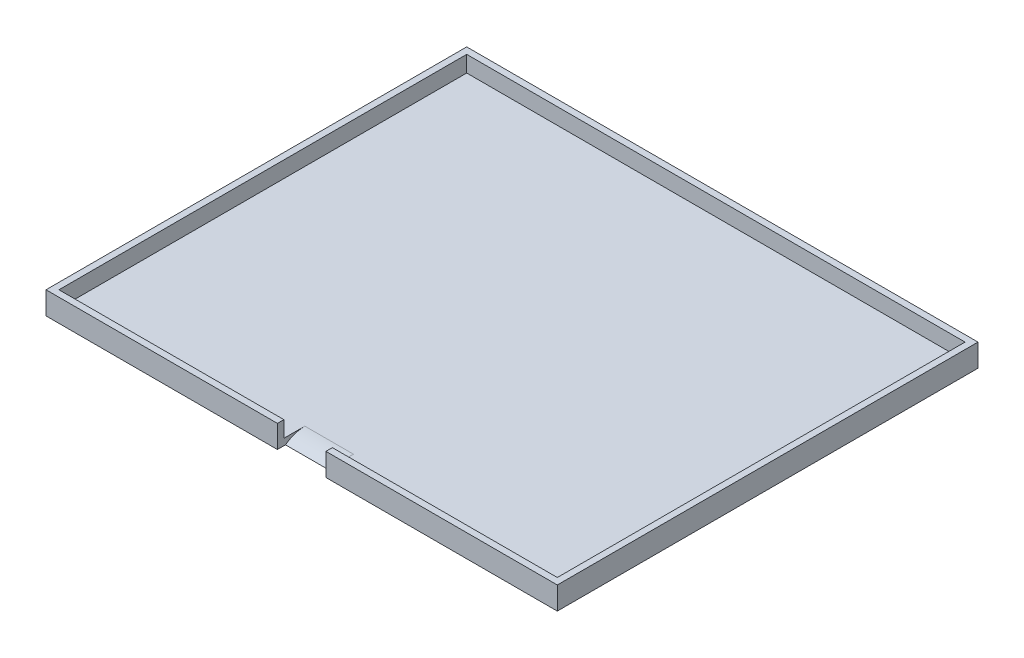
ISO-10303-21;
HEADER;
FILE_DESCRIPTION(('STEP AP214'),'2;1');
FILE_NAME('part.step','',(''),(''),'','','');
FILE_SCHEMA(('AUTOMOTIVE_DESIGN { 1 0 10303 214 1 1 1 1 }'));
ENDSEC;
DATA;
#1=APPLICATION_CONTEXT('core data for automotive mechanical design processes');
#2=APPLICATION_PROTOCOL_DEFINITION('international standard','automotive_design',2000,#1);
#3=PRODUCT_CONTEXT('',#1,'mechanical');
#4=PRODUCT('Part','Part','',(#3));
#5=PRODUCT_RELATED_PRODUCT_CATEGORY('part','',(#4));
#6=PRODUCT_DEFINITION_FORMATION('','',#4);
#7=PRODUCT_DEFINITION_CONTEXT('part definition',#1,'design');
#8=PRODUCT_DEFINITION('design','',#6,#7);
#9=PRODUCT_DEFINITION_SHAPE('','',#8);
#10=(LENGTH_UNIT() NAMED_UNIT(*) SI_UNIT(.MILLI.,.METRE.));
#11=(NAMED_UNIT(*) PLANE_ANGLE_UNIT() SI_UNIT($,.RADIAN.));
#12=(NAMED_UNIT(*) SI_UNIT($,.STERADIAN.) SOLID_ANGLE_UNIT());
#13=UNCERTAINTY_MEASURE_WITH_UNIT(LENGTH_MEASURE(1.E-05),#10,'distance_accuracy_value','');
#14=(GEOMETRIC_REPRESENTATION_CONTEXT(3) GLOBAL_UNCERTAINTY_ASSIGNED_CONTEXT((#13)) GLOBAL_UNIT_ASSIGNED_CONTEXT((#10,
#11,#12)) REPRESENTATION_CONTEXT('',''));
#15=CARTESIAN_POINT('',(0.,0.,0.));
#16=DIRECTION('',(0.,0.,1.));
#17=DIRECTION('',(1.,0.,0.));
#18=AXIS2_PLACEMENT_3D('',#15,#16,#17);
#19=CARTESIAN_POINT('',(-39.5,3.5,32.5));
#20=DIRECTION('',(0.,0.,-1.));
#21=DIRECTION('',(-1.,0.,0.));
#22=AXIS2_PLACEMENT_3D('',#19,#20,#21);
#23=PLANE('',#22);
#24=DIRECTION('',(1.,0.,0.));
#25=VECTOR('',#24,1.);
#26=CARTESIAN_POINT('',(-39.5,3.5,32.5));
#27=LINE('',#26,#25);
#28=CARTESIAN_POINT('',(3.75,3.5,32.5));
#29=VERTEX_POINT('',#28);
#30=CARTESIAN_POINT('',(39.5,3.5,32.5));
#31=VERTEX_POINT('',#30);
#32=EDGE_CURVE('E218',#29,#31,#27,.T.);
#33=ORIENTED_EDGE('',*,*,#32,.F.);
#34=DIRECTION('',(0.,1.,0.));
#35=VECTOR('',#34,1.);
#36=CARTESIAN_POINT('',(3.75,5.5,32.5));
#37=LINE('',#36,#35);
#38=CARTESIAN_POINT('',(3.75,0.,32.5));
#39=VERTEX_POINT('',#38);
#40=EDGE_CURVE('E165',#39,#29,#37,.T.);
#41=ORIENTED_EDGE('',*,*,#40,.F.);
#42=DIRECTION('',(1.,0.,0.));
#43=VECTOR('',#42,1.);
#44=CARTESIAN_POINT('',(-39.5,0.,32.5));
#45=LINE('',#44,#43);
#46=CARTESIAN_POINT('',(39.5,0.,32.5));
#47=VERTEX_POINT('',#46);
#48=EDGE_CURVE('E155',#39,#47,#45,.T.);
#49=ORIENTED_EDGE('',*,*,#48,.T.);
#50=DIRECTION('',(0.,-1.,0.));
#51=VECTOR('',#50,1.);
#52=CARTESIAN_POINT('',(39.5,3.5,32.5));
#53=LINE('',#52,#51);
#54=EDGE_CURVE('E222',#31,#47,#53,.T.);
#55=ORIENTED_EDGE('',*,*,#54,.F.);
#56=EDGE_LOOP('',(#33,#41,#49,#55));
#57=FACE_BOUND('',#56,.T.);
#58=ADVANCED_FACE('F41',(#57),#23,.F.);
#59=CARTESIAN_POINT('',(38.5,1.,31.5));
#60=DIRECTION('',(0.,0.,1.));
#61=DIRECTION('',(1.,0.,0.));
#62=AXIS2_PLACEMENT_3D('',#59,#60,#61);
#63=PLANE('',#62);
#64=DIRECTION('',(1.,0.,0.));
#65=VECTOR('',#64,1.);
#66=CARTESIAN_POINT('',(38.5,1.,31.5));
#67=LINE('',#66,#65);
#68=CARTESIAN_POINT('',(3.75,1.,31.5));
#69=VERTEX_POINT('',#68);
#70=CARTESIAN_POINT('',(38.5,1.,31.5));
#71=VERTEX_POINT('',#70);
#72=EDGE_CURVE('E179',#69,#71,#67,.T.);
#73=ORIENTED_EDGE('',*,*,#72,.F.);
#74=DIRECTION('',(0.,1.,0.));
#75=VECTOR('',#74,1.);
#76=CARTESIAN_POINT('',(3.75,1.,31.5));
#77=LINE('',#76,#75);
#78=CARTESIAN_POINT('',(3.75,3.5,31.5));
#79=VERTEX_POINT('',#78);
#80=EDGE_CURVE('E172',#69,#79,#77,.T.);
#81=ORIENTED_EDGE('',*,*,#80,.T.);
#82=DIRECTION('',(1.,0.,0.));
#83=VECTOR('',#82,1.);
#84=CARTESIAN_POINT('',(38.5,3.5,31.5));
#85=LINE('',#84,#83);
#86=CARTESIAN_POINT('',(38.5,3.5,31.5));
#87=VERTEX_POINT('',#86);
#88=EDGE_CURVE('E191',#79,#87,#85,.T.);
#89=ORIENTED_EDGE('',*,*,#88,.T.);
#90=DIRECTION('',(0.,1.,0.));
#91=VECTOR('',#90,1.);
#92=CARTESIAN_POINT('',(38.5,1.,31.5));
#93=LINE('',#92,#91);
#94=EDGE_CURVE('E205',#71,#87,#93,.T.);
#95=ORIENTED_EDGE('',*,*,#94,.F.);
#96=EDGE_LOOP('',(#73,#81,#89,#95));
#97=FACE_BOUND('',#96,.T.);
#98=ADVANCED_FACE('F248',(#97),#63,.F.);
#99=CARTESIAN_POINT('',(39.5,3.5,-32.5));
#100=DIRECTION('',(-1.,0.,0.));
#101=DIRECTION('',(0.,0.,1.));
#102=AXIS2_PLACEMENT_3D('',#99,#100,#101);
#103=PLANE('',#102);
#104=DIRECTION('',(0.,0.,-1.));
#105=VECTOR('',#104,1.);
#106=CARTESIAN_POINT('',(39.5,0.,-32.5));
#107=LINE('',#106,#105);
#108=CARTESIAN_POINT('',(39.5,0.,-32.5));
#109=VERTEX_POINT('',#108);
#110=EDGE_CURVE('E202',#47,#109,#107,.T.);
#111=ORIENTED_EDGE('',*,*,#110,.T.);
#112=DIRECTION('',(0.,-1.,0.));
#113=VECTOR('',#112,1.);
#114=CARTESIAN_POINT('',(39.5,3.5,-32.5));
#115=LINE('',#114,#113);
#116=CARTESIAN_POINT('',(39.5,3.5,-32.5));
#117=VERTEX_POINT('',#116);
#118=EDGE_CURVE('E239',#117,#109,#115,.T.);
#119=ORIENTED_EDGE('',*,*,#118,.F.);
#120=DIRECTION('',(0.,0.,-1.));
#121=VECTOR('',#120,1.);
#122=CARTESIAN_POINT('',(39.5,3.5,-32.5));
#123=LINE('',#122,#121);
#124=EDGE_CURVE('E210',#31,#117,#123,.T.);
#125=ORIENTED_EDGE('',*,*,#124,.F.);
#126=ORIENTED_EDGE('',*,*,#54,.T.);
#127=EDGE_LOOP('',(#111,#119,#125,#126));
#128=FACE_BOUND('',#127,.T.);
#129=ADVANCED_FACE('F288',(#128),#103,.F.);
#130=CARTESIAN_POINT('',(-39.5,3.5,-32.5));
#131=DIRECTION('',(0.,0.,1.));
#132=DIRECTION('',(1.,0.,0.));
#133=AXIS2_PLACEMENT_3D('',#130,#131,#132);
#134=PLANE('',#133);
#135=DIRECTION('',(-1.,0.,0.));
#136=VECTOR('',#135,1.);
#137=CARTESIAN_POINT('',(-39.5,0.,-32.5));
#138=LINE('',#137,#136);
#139=CARTESIAN_POINT('',(-39.5,0.,-32.5));
#140=VERTEX_POINT('',#139);
#141=EDGE_CURVE('E225',#109,#140,#138,.T.);
#142=ORIENTED_EDGE('',*,*,#141,.T.);
#143=DIRECTION('',(0.,-1.,0.));
#144=VECTOR('',#143,1.);
#145=CARTESIAN_POINT('',(-39.5,3.5,-32.5));
#146=LINE('',#145,#144);
#147=CARTESIAN_POINT('',(-39.5,3.5,-32.5));
#148=VERTEX_POINT('',#147);
#149=EDGE_CURVE('E236',#148,#140,#146,.T.);
#150=ORIENTED_EDGE('',*,*,#149,.F.);
#151=DIRECTION('',(-1.,0.,0.));
#152=VECTOR('',#151,1.);
#153=CARTESIAN_POINT('',(-39.5,3.5,-32.5));
#154=LINE('',#153,#152);
#155=EDGE_CURVE('E213',#117,#148,#154,.T.);
#156=ORIENTED_EDGE('',*,*,#155,.F.);
#157=ORIENTED_EDGE('',*,*,#118,.T.);
#158=EDGE_LOOP('',(#142,#150,#156,#157));
#159=FACE_BOUND('',#158,.T.);
#160=ADVANCED_FACE('F284',(#159),#134,.F.);
#161=CARTESIAN_POINT('',(-39.5,3.5,-32.5));
#162=DIRECTION('',(1.,0.,0.));
#163=DIRECTION('',(0.,0.,-1.));
#164=AXIS2_PLACEMENT_3D('',#161,#162,#163);
#165=PLANE('',#164);
#166=DIRECTION('',(0.,0.,1.));
#167=VECTOR('',#166,1.);
#168=CARTESIAN_POINT('',(-39.5,0.,-32.5));
#169=LINE('',#168,#167);
#170=CARTESIAN_POINT('',(-39.5,0.,32.5));
#171=VERTEX_POINT('',#170);
#172=EDGE_CURVE('E227',#140,#171,#169,.T.);
#173=ORIENTED_EDGE('',*,*,#172,.T.);
#174=DIRECTION('',(0.,-1.,0.));
#175=VECTOR('',#174,1.);
#176=CARTESIAN_POINT('',(-39.5,3.5,32.5));
#177=LINE('',#176,#175);
#178=CARTESIAN_POINT('',(-39.5,3.5,32.5));
#179=VERTEX_POINT('',#178);
#180=EDGE_CURVE('E233',#179,#171,#177,.T.);
#181=ORIENTED_EDGE('',*,*,#180,.F.);
#182=DIRECTION('',(0.,0.,1.));
#183=VECTOR('',#182,1.);
#184=CARTESIAN_POINT('',(-39.5,3.5,-32.5));
#185=LINE('',#184,#183);
#186=EDGE_CURVE('E216',#148,#179,#185,.T.);
#187=ORIENTED_EDGE('',*,*,#186,.F.);
#188=ORIENTED_EDGE('',*,*,#149,.T.);
#189=EDGE_LOOP('',(#173,#181,#187,#188));
#190=FACE_BOUND('',#189,.T.);
#191=ADVANCED_FACE('F281',(#190),#165,.F.);
#192=CARTESIAN_POINT('',(-3.75,0.,32.5));
#193=VERTEX_POINT('',#192);
#194=EDGE_CURVE('E214',#171,#193,#45,.T.);
#195=ORIENTED_EDGE('',*,*,#194,.T.);
#196=DIRECTION('',(0.,-1.,0.));
#197=VECTOR('',#196,1.);
#198=CARTESIAN_POINT('',(-3.75,5.5,32.5));
#199=LINE('',#198,#197);
#200=CARTESIAN_POINT('',(-3.75,3.5,32.5));
#201=VERTEX_POINT('',#200);
#202=EDGE_CURVE('E160',#201,#193,#199,.T.);
#203=ORIENTED_EDGE('',*,*,#202,.F.);
#204=EDGE_CURVE('E219',#179,#201,#27,.T.);
#205=ORIENTED_EDGE('',*,*,#204,.F.);
#206=ORIENTED_EDGE('',*,*,#180,.T.);
#207=EDGE_LOOP('',(#195,#203,#205,#206));
#208=FACE_BOUND('',#207,.T.);
#209=ADVANCED_FACE('F277',(#208),#23,.F.);
#210=CARTESIAN_POINT('',(0.,3.5,0.));
#211=DIRECTION('',(0.,1.,0.));
#212=DIRECTION('',(0.,0.,1.));
#213=AXIS2_PLACEMENT_3D('',#210,#211,#212);
#214=PLANE('',#213);
#215=DIRECTION('',(0.,0.,-1.));
#216=VECTOR('',#215,1.);
#217=CARTESIAN_POINT('',(3.75,3.5,0.));
#218=LINE('',#217,#216);
#219=EDGE_CURVE('E157',#29,#79,#218,.T.);
#220=ORIENTED_EDGE('',*,*,#219,.F.);
#221=ORIENTED_EDGE('',*,*,#32,.T.);
#222=ORIENTED_EDGE('',*,*,#124,.T.);
#223=ORIENTED_EDGE('',*,*,#155,.T.);
#224=ORIENTED_EDGE('',*,*,#186,.T.);
#225=ORIENTED_EDGE('',*,*,#204,.T.);
#226=DIRECTION('',(0.,0.,1.));
#227=VECTOR('',#226,1.);
#228=CARTESIAN_POINT('',(-3.75,3.5,0.));
#229=LINE('',#228,#227);
#230=CARTESIAN_POINT('',(-3.75,3.5,31.5));
#231=VERTEX_POINT('',#230);
#232=EDGE_CURVE('E163',#231,#201,#229,.T.);
#233=ORIENTED_EDGE('',*,*,#232,.F.);
#234=CARTESIAN_POINT('',(-38.5,3.5,31.5));
#235=VERTEX_POINT('',#234);
#236=EDGE_CURVE('E192',#235,#231,#85,.T.);
#237=ORIENTED_EDGE('',*,*,#236,.F.);
#238=DIRECTION('',(0.,0.,1.));
#239=VECTOR('',#238,1.);
#240=CARTESIAN_POINT('',(-38.5,3.5,31.5));
#241=LINE('',#240,#239);
#242=CARTESIAN_POINT('',(-38.5,3.5,-31.5));
#243=VERTEX_POINT('',#242);
#244=EDGE_CURVE('E156',#243,#235,#241,.T.);
#245=ORIENTED_EDGE('',*,*,#244,.F.);
#246=DIRECTION('',(-1.,0.,0.));
#247=VECTOR('',#246,1.);
#248=CARTESIAN_POINT('',(38.5,3.5,-31.5));
#249=LINE('',#248,#247);
#250=CARTESIAN_POINT('',(38.5,3.5,-31.5));
#251=VERTEX_POINT('',#250);
#252=EDGE_CURVE('E180',#251,#243,#249,.T.);
#253=ORIENTED_EDGE('',*,*,#252,.F.);
#254=DIRECTION('',(0.,0.,-1.));
#255=VECTOR('',#254,1.);
#256=CARTESIAN_POINT('',(38.5,3.5,31.5));
#257=LINE('',#256,#255);
#258=EDGE_CURVE('E195',#87,#251,#257,.T.);
#259=ORIENTED_EDGE('',*,*,#258,.F.);
#260=ORIENTED_EDGE('',*,*,#88,.F.);
#261=EDGE_LOOP('',(#220,#221,#222,#223,#224,#225,#233,#237,#245,#253,#259,#260));
#262=FACE_BOUND('',#261,.T.);
#263=ADVANCED_FACE('F272',(#262),#214,.T.);
#264=CARTESIAN_POINT('',(0.,0.,0.));
#265=DIRECTION('',(0.,1.,0.));
#266=DIRECTION('',(0.,0.,1.));
#267=AXIS2_PLACEMENT_3D('',#264,#265,#266);
#268=PLANE('',#267);
#269=ORIENTED_EDGE('',*,*,#48,.F.);
#270=DIRECTION('',(0.,0.,-1.));
#271=VECTOR('',#270,1.);
#272=CARTESIAN_POINT('',(3.75,0.,0.));
#273=LINE('',#272,#271);
#274=CARTESIAN_POINT('',(3.75,0.,31.25));
#275=VERTEX_POINT('',#274);
#276=EDGE_CURVE('E141',#39,#275,#273,.T.);
#277=ORIENTED_EDGE('',*,*,#276,.T.);
#278=DIRECTION('',(1.,0.,0.));
#279=VECTOR('',#278,1.);
#280=CARTESIAN_POINT('',(0.,0.,31.25));
#281=LINE('',#280,#279);
#282=CARTESIAN_POINT('',(-3.75,0.,31.25));
#283=VERTEX_POINT('',#282);
#284=EDGE_CURVE('E152',#283,#275,#281,.T.);
#285=ORIENTED_EDGE('',*,*,#284,.F.);
#286=DIRECTION('',(0.,0.,1.));
#287=VECTOR('',#286,1.);
#288=CARTESIAN_POINT('',(-3.75,0.,0.));
#289=LINE('',#288,#287);
#290=EDGE_CURVE('E170',#283,#193,#289,.T.);
#291=ORIENTED_EDGE('',*,*,#290,.T.);
#292=ORIENTED_EDGE('',*,*,#194,.F.);
#293=ORIENTED_EDGE('',*,*,#172,.F.);
#294=ORIENTED_EDGE('',*,*,#141,.F.);
#295=ORIENTED_EDGE('',*,*,#110,.F.);
#296=EDGE_LOOP('',(#269,#277,#285,#291,#292,#293,#294,#295));
#297=FACE_BOUND('',#296,.T.);
#298=ADVANCED_FACE('F150',(#297),#268,.F.);
#299=CARTESIAN_POINT('',(-38.5,1.,31.5));
#300=DIRECTION('',(-1.,0.,0.));
#301=DIRECTION('',(0.,0.,1.));
#302=AXIS2_PLACEMENT_3D('',#299,#300,#301);
#303=PLANE('',#302);
#304=ORIENTED_EDGE('',*,*,#244,.T.);
#305=DIRECTION('',(0.,1.,0.));
#306=VECTOR('',#305,1.);
#307=CARTESIAN_POINT('',(-38.5,1.,31.5));
#308=LINE('',#307,#306);
#309=CARTESIAN_POINT('',(-38.5,1.,31.5));
#310=VERTEX_POINT('',#309);
#311=EDGE_CURVE('E189',#310,#235,#308,.T.);
#312=ORIENTED_EDGE('',*,*,#311,.F.);
#313=DIRECTION('',(0.,0.,1.));
#314=VECTOR('',#313,1.);
#315=CARTESIAN_POINT('',(-38.5,1.,31.5));
#316=LINE('',#315,#314);
#317=CARTESIAN_POINT('',(-38.5,1.,-31.5));
#318=VERTEX_POINT('',#317);
#319=EDGE_CURVE('E176',#318,#310,#316,.T.);
#320=ORIENTED_EDGE('',*,*,#319,.F.);
#321=DIRECTION('',(0.,1.,0.));
#322=VECTOR('',#321,1.);
#323=CARTESIAN_POINT('',(-38.5,1.,-31.5));
#324=LINE('',#323,#322);
#325=EDGE_CURVE('E200',#318,#243,#324,.T.);
#326=ORIENTED_EDGE('',*,*,#325,.T.);
#327=EDGE_LOOP('',(#304,#312,#320,#326));
#328=FACE_BOUND('',#327,.T.);
#329=ADVANCED_FACE('F261',(#328),#303,.F.);
#330=CARTESIAN_POINT('',(38.5,1.,-31.5));
#331=DIRECTION('',(0.,0.,-1.));
#332=DIRECTION('',(-1.,0.,0.));
#333=AXIS2_PLACEMENT_3D('',#330,#331,#332);
#334=PLANE('',#333);
#335=ORIENTED_EDGE('',*,*,#252,.T.);
#336=ORIENTED_EDGE('',*,*,#325,.F.);
#337=DIRECTION('',(-1.,0.,0.));
#338=VECTOR('',#337,1.);
#339=CARTESIAN_POINT('',(38.5,1.,-31.5));
#340=LINE('',#339,#338);
#341=CARTESIAN_POINT('',(38.5,1.,-31.5));
#342=VERTEX_POINT('',#341);
#343=EDGE_CURVE('E186',#342,#318,#340,.T.);
#344=ORIENTED_EDGE('',*,*,#343,.F.);
#345=DIRECTION('',(0.,1.,0.));
#346=VECTOR('',#345,1.);
#347=CARTESIAN_POINT('',(38.5,1.,-31.5));
#348=LINE('',#347,#346);
#349=EDGE_CURVE('E203',#342,#251,#348,.T.);
#350=ORIENTED_EDGE('',*,*,#349,.T.);
#351=EDGE_LOOP('',(#335,#336,#344,#350));
#352=FACE_BOUND('',#351,.T.);
#353=ADVANCED_FACE('F256',(#352),#334,.F.);
#354=CARTESIAN_POINT('',(38.5,1.,31.5));
#355=DIRECTION('',(1.,0.,0.));
#356=DIRECTION('',(0.,0.,-1.));
#357=AXIS2_PLACEMENT_3D('',#354,#355,#356);
#358=PLANE('',#357);
#359=ORIENTED_EDGE('',*,*,#258,.T.);
#360=ORIENTED_EDGE('',*,*,#349,.F.);
#361=DIRECTION('',(0.,0.,-1.));
#362=VECTOR('',#361,1.);
#363=CARTESIAN_POINT('',(38.5,1.,31.5));
#364=LINE('',#363,#362);
#365=EDGE_CURVE('E183',#71,#342,#364,.T.);
#366=ORIENTED_EDGE('',*,*,#365,.F.);
#367=ORIENTED_EDGE('',*,*,#94,.T.);
#368=EDGE_LOOP('',(#359,#360,#366,#367));
#369=FACE_BOUND('',#368,.T.);
#370=ADVANCED_FACE('F253',(#369),#358,.F.);
#371=ORIENTED_EDGE('',*,*,#236,.T.);
#372=DIRECTION('',(0.,-1.,0.));
#373=VECTOR('',#372,1.);
#374=CARTESIAN_POINT('',(-3.75,0.999999999999998,31.5));
#375=LINE('',#374,#373);
#376=CARTESIAN_POINT('',(-3.75,1.,31.5));
#377=VERTEX_POINT('',#376);
#378=EDGE_CURVE('E159',#231,#377,#375,.T.);
#379=ORIENTED_EDGE('',*,*,#378,.T.);
#380=EDGE_CURVE('E181',#310,#377,#67,.T.);
#381=ORIENTED_EDGE('',*,*,#380,.F.);
#382=ORIENTED_EDGE('',*,*,#311,.T.);
#383=EDGE_LOOP('',(#371,#379,#381,#382));
#384=FACE_BOUND('',#383,.T.);
#385=ADVANCED_FACE('F264',(#384),#63,.F.);
#386=CARTESIAN_POINT('',(0.,1.,0.));
#387=DIRECTION('',(0.,1.,0.));
#388=DIRECTION('',(0.,0.,1.));
#389=AXIS2_PLACEMENT_3D('',#386,#387,#388);
#390=PLANE('',#389);
#391=DIRECTION('',(1.,0.,0.));
#392=VECTOR('',#391,1.);
#393=CARTESIAN_POINT('',(3.75,1.,28.25));
#394=LINE('',#393,#392);
#395=CARTESIAN_POINT('',(-3.75,1.,28.25));
#396=VERTEX_POINT('',#395);
#397=CARTESIAN_POINT('',(3.75,1.,28.25));
#398=VERTEX_POINT('',#397);
#399=EDGE_CURVE('E146',#396,#398,#394,.T.);
#400=ORIENTED_EDGE('',*,*,#399,.T.);
#401=DIRECTION('',(0.,0.,-1.));
#402=VECTOR('',#401,1.);
#403=CARTESIAN_POINT('',(3.75,1.,0.));
#404=LINE('',#403,#402);
#405=EDGE_CURVE('E56',#69,#398,#404,.T.);
#406=ORIENTED_EDGE('',*,*,#405,.F.);
#407=ORIENTED_EDGE('',*,*,#72,.T.);
#408=ORIENTED_EDGE('',*,*,#365,.T.);
#409=ORIENTED_EDGE('',*,*,#343,.T.);
#410=ORIENTED_EDGE('',*,*,#319,.T.);
#411=ORIENTED_EDGE('',*,*,#380,.T.);
#412=DIRECTION('',(0.,0.,1.));
#413=VECTOR('',#412,1.);
#414=CARTESIAN_POINT('',(-3.75,1.,0.));
#415=LINE('',#414,#413);
#416=EDGE_CURVE('E64',#396,#377,#415,.T.);
#417=ORIENTED_EDGE('',*,*,#416,.F.);
#418=EDGE_LOOP('',(#400,#406,#407,#408,#409,#410,#411,#417));
#419=FACE_BOUND('',#418,.T.);
#420=ADVANCED_FACE('F244',(#419),#390,.T.);
#421=CARTESIAN_POINT('',(3.75,5.5,31.25));
#422=DIRECTION('',(1.,0.,0.));
#423=DIRECTION('',(0.,0.,-1.));
#424=AXIS2_PLACEMENT_3D('',#421,#422,#423);
#425=PLANE('',#424);
#426=ORIENTED_EDGE('',*,*,#40,.T.);
#427=ORIENTED_EDGE('',*,*,#219,.T.);
#428=ORIENTED_EDGE('',*,*,#80,.F.);
#429=ORIENTED_EDGE('',*,*,#405,.T.);
#430=CARTESIAN_POINT('',(3.75,-4.,28.25));
#431=DIRECTION('',(1.,0.,0.));
#432=DIRECTION('',(0.,0.,-1.));
#433=AXIS2_PLACEMENT_3D('',#430,#431,#432);
#434=CIRCLE('',#433,5.);
#435=EDGE_CURVE('E49',#398,#275,#434,.T.);
#436=ORIENTED_EDGE('',*,*,#435,.T.);
#437=ORIENTED_EDGE('',*,*,#276,.F.);
#438=EDGE_LOOP('',(#426,#427,#428,#429,#436,#437));
#439=FACE_BOUND('',#438,.T.);
#440=ADVANCED_FACE('F140',(#439),#425,.F.);
#441=CARTESIAN_POINT('',(-3.75,5.5,31.25));
#442=DIRECTION('',(-1.,0.,0.));
#443=DIRECTION('',(0.,-1.,0.));
#444=AXIS2_PLACEMENT_3D('',#441,#442,#443);
#445=PLANE('',#444);
#446=ORIENTED_EDGE('',*,*,#290,.F.);
#447=CARTESIAN_POINT('',(-3.75,-4.,28.25));
#448=DIRECTION('',(-1.,0.,0.));
#449=DIRECTION('',(0.,-1.,0.));
#450=AXIS2_PLACEMENT_3D('',#447,#448,#449);
#451=CIRCLE('',#450,5.);
#452=EDGE_CURVE('E11',#283,#396,#451,.T.);
#453=ORIENTED_EDGE('',*,*,#452,.T.);
#454=ORIENTED_EDGE('',*,*,#416,.T.);
#455=ORIENTED_EDGE('',*,*,#378,.F.);
#456=ORIENTED_EDGE('',*,*,#232,.T.);
#457=ORIENTED_EDGE('',*,*,#202,.T.);
#458=EDGE_LOOP('',(#446,#453,#454,#455,#456,#457));
#459=FACE_BOUND('',#458,.T.);
#460=ADVANCED_FACE('F268',(#459),#445,.F.);
#461=CARTESIAN_POINT('',(0.,-4.,28.25));
#462=DIRECTION('',(-1.,0.,0.));
#463=DIRECTION('',(0.,0.,1.));
#464=AXIS2_PLACEMENT_3D('',#461,#462,#463);
#465=CYLINDRICAL_SURFACE('',#464,5.);
#466=ORIENTED_EDGE('',*,*,#452,.F.);
#467=ORIENTED_EDGE('',*,*,#284,.T.);
#468=ORIENTED_EDGE('',*,*,#435,.F.);
#469=ORIENTED_EDGE('',*,*,#399,.F.);
#470=EDGE_LOOP('',(#466,#467,#468,#469));
#471=FACE_BOUND('',#470,.T.);
#472=ADVANCED_FACE('F43',(#471),#465,.T.);
#473=CLOSED_SHELL('',(#58,#98,#129,#160,#191,#209,#263,#298,#329,#353,#370,#385,#420,#440,#460,#472));
#474=MANIFOLD_SOLID_BREP('B2',#473);
#475=ADVANCED_BREP_SHAPE_REPRESENTATION('',(#18,#474),#14);
#476=SHAPE_DEFINITION_REPRESENTATION(#9,#475);
ENDSEC;
END-ISO-10303-21;
